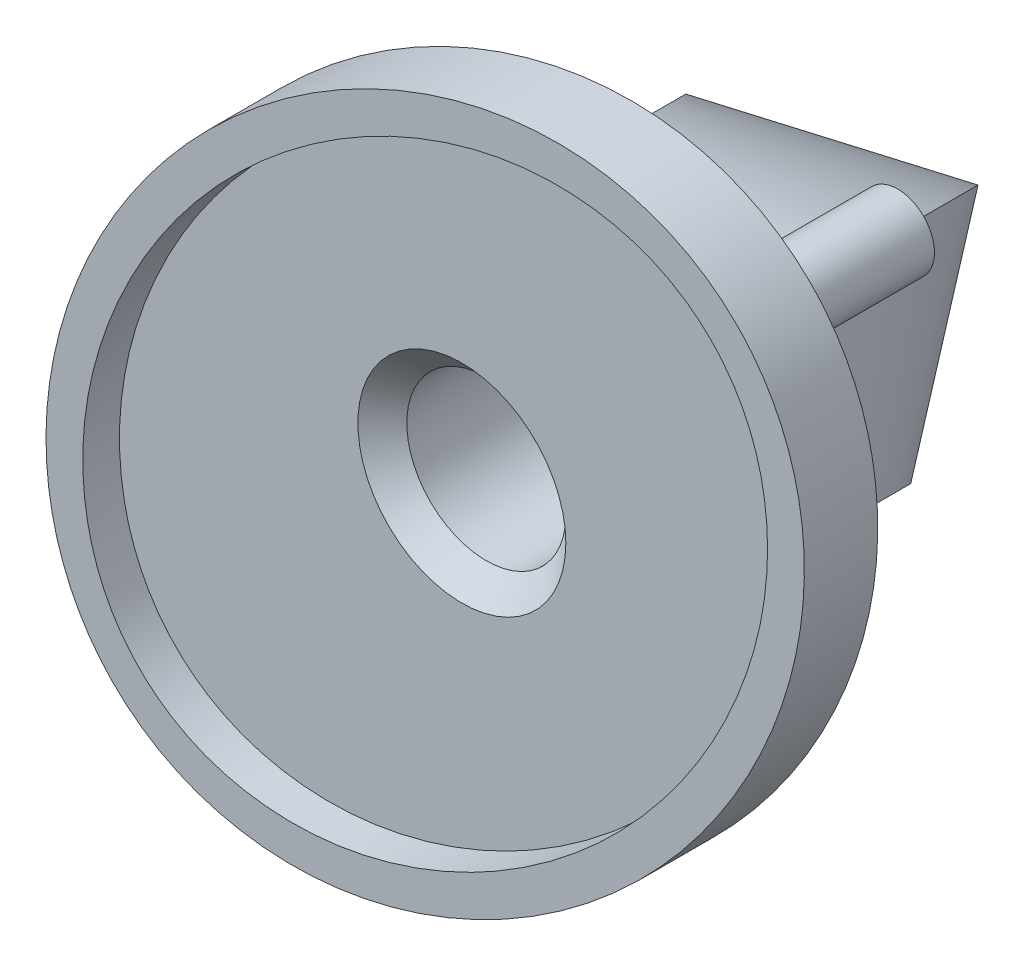
ISO-10303-21;
HEADER;
FILE_DESCRIPTION(('STEP AP214'),'2;1');
FILE_NAME('part.step','',(''),(''),'','','');
FILE_SCHEMA(('AUTOMOTIVE_DESIGN { 1 0 10303 214 1 1 1 1 }'));
ENDSEC;
DATA;
#1=APPLICATION_CONTEXT('core data for automotive mechanical design processes');
#2=APPLICATION_PROTOCOL_DEFINITION('international standard','automotive_design',2000,#1);
#3=PRODUCT_CONTEXT('',#1,'mechanical');
#4=PRODUCT('Part','Part','',(#3));
#5=PRODUCT_RELATED_PRODUCT_CATEGORY('part','',(#4));
#6=PRODUCT_DEFINITION_FORMATION('','',#4);
#7=PRODUCT_DEFINITION_CONTEXT('part definition',#1,'design');
#8=PRODUCT_DEFINITION('design','',#6,#7);
#9=PRODUCT_DEFINITION_SHAPE('','',#8);
#10=(LENGTH_UNIT() NAMED_UNIT(*) SI_UNIT(.MILLI.,.METRE.));
#11=(NAMED_UNIT(*) PLANE_ANGLE_UNIT() SI_UNIT($,.RADIAN.));
#12=(NAMED_UNIT(*) SI_UNIT($,.STERADIAN.) SOLID_ANGLE_UNIT());
#13=UNCERTAINTY_MEASURE_WITH_UNIT(LENGTH_MEASURE(1.E-05),#10,'distance_accuracy_value','');
#14=(GEOMETRIC_REPRESENTATION_CONTEXT(3) GLOBAL_UNCERTAINTY_ASSIGNED_CONTEXT((#13)) GLOBAL_UNIT_ASSIGNED_CONTEXT((#10,
#11,#12)) REPRESENTATION_CONTEXT('',''));
#15=CARTESIAN_POINT('',(0.,0.,0.));
#16=DIRECTION('',(0.,0.,1.));
#17=DIRECTION('',(1.,0.,0.));
#18=AXIS2_PLACEMENT_3D('',#15,#16,#17);
#19=CARTESIAN_POINT('',(0.,1.75,-1.5));
#20=DIRECTION('',(0.,-1.,0.));
#21=DIRECTION('',(0.,0.,-1.));
#22=AXIS2_PLACEMENT_3D('',#19,#20,#21);
#23=PLANE('',#22);
#24=DIRECTION('',(0.,0.,1.));
#25=VECTOR('',#24,1.);
#26=CARTESIAN_POINT('',(2.73861278752583,1.75,-1.5));
#27=LINE('',#26,#25);
#28=CARTESIAN_POINT('',(2.73861278752583,1.75,-13.5));
#29=VERTEX_POINT('',#28);
#30=CARTESIAN_POINT('',(2.73861278752583,1.75,-6.));
#31=VERTEX_POINT('',#30);
#32=EDGE_CURVE('E121',#29,#31,#27,.T.);
#33=ORIENTED_EDGE('',*,*,#32,.T.);
#34=DIRECTION('',(-1.,0.,0.));
#35=VECTOR('',#34,1.);
#36=CARTESIAN_POINT('',(0.,1.75,-6.));
#37=LINE('',#36,#35);
#38=CARTESIAN_POINT('',(-2.73861278752583,1.75,-6.));
#39=VERTEX_POINT('',#38);
#40=EDGE_CURVE('E346',#31,#39,#37,.T.);
#41=ORIENTED_EDGE('',*,*,#40,.T.);
#42=DIRECTION('',(0.,0.,1.));
#43=VECTOR('',#42,1.);
#44=CARTESIAN_POINT('',(-2.73861278752583,1.75,-1.5));
#45=LINE('',#44,#43);
#46=CARTESIAN_POINT('',(-2.73861278752583,1.75,-13.5));
#47=VERTEX_POINT('',#46);
#48=EDGE_CURVE('E132',#47,#39,#45,.T.);
#49=ORIENTED_EDGE('',*,*,#48,.F.);
#50=DIRECTION('',(-1.,0.,0.));
#51=VECTOR('',#50,1.);
#52=CARTESIAN_POINT('',(2.73861278752583,1.75,-13.5));
#53=LINE('',#52,#51);
#54=EDGE_CURVE('E137',#29,#47,#53,.T.);
#55=ORIENTED_EDGE('',*,*,#54,.F.);
#56=EDGE_LOOP('',(#33,#41,#49,#55));
#57=FACE_BOUND('',#56,.T.);
#58=ADVANCED_FACE('F57',(#57),#23,.T.);
#59=CARTESIAN_POINT('',(4.59619407771255,-4.59619407771257,-1.5));
#60=DIRECTION('',(-0.707106781186546,0.707106781186549,0.));
#61=DIRECTION('',(-0.707106781186549,-0.707106781186546,0.));
#62=AXIS2_PLACEMENT_3D('',#59,#60,#61);
#63=CONICAL_SURFACE('',#62,10.,0.745419476274158);
#64=CARTESIAN_POINT('',(11.3675294374418,9.81467437442868,-0.9998));
#65=CARTESIAN_POINT('',(11.3706137012121,9.81478939033697,-1.12559662171696));
#66=CARTESIAN_POINT('',(11.372534422561,9.81486303084294,-1.25141886066279));
#67=CARTESIAN_POINT('',(11.3740482815762,9.81492164569019,-1.50307724922639));
#68=CARTESIAN_POINT('',(11.3736414212789,9.81490662010902,-1.62891339883189));
#69=CARTESIAN_POINT('',(11.3689291445444,9.81471968806605,-2.00635343013596));
#70=CARTESIAN_POINT('',(11.3611328567553,9.8144059602027,-2.25792253493445));
#71=CARTESIAN_POINT('',(11.3363250445813,9.81382876508889,-2.75910442610907));
#72=CARTESIAN_POINT('',(11.3193684082185,9.81356501098766,-3.00871997063354));
#73=CARTESIAN_POINT('',(11.2763269365788,9.81401970211461,-3.50718748745144));
#74=CARTESIAN_POINT('',(11.2502412933191,9.81473823429858,-3.75603939018979));
#75=CARTESIAN_POINT('',(11.1885306056162,9.81861575626189,-4.25679610144112));
#76=CARTESIAN_POINT('',(11.1527522799192,9.82181564941633,-4.50868172837949));
#77=CARTESIAN_POINT('',(11.072063271918,9.83273874180308,-5.0108565979712));
#78=CARTESIAN_POINT('',(11.0271545232362,9.84046098395157,-5.2611461670785));
#79=CARTESIAN_POINT('',(10.9530495070987,9.85749197628367,-5.63579764000728));
#80=CARTESIAN_POINT('',(10.9271330717293,9.86410602712989,-5.76093850734703));
#81=CARTESIAN_POINT('',(10.8731443156247,9.87959113970417,-6.0106101098969));
#82=CARTESIAN_POINT('',(10.8450721212387,9.88846206922669,-6.13514088041046));
#83=CARTESIAN_POINT('',(10.7868303347956,9.90894595265881,-6.38359204595669));
#84=CARTESIAN_POINT('',(10.7566591356605,9.92056102425792,-6.50751189375605));
#85=CARTESIAN_POINT('',(10.6943518082272,9.94713338066743,-6.75452201589148));
#86=CARTESIAN_POINT('',(10.6622152643118,9.96209137420328,-6.87761210860396));
#87=CARTESIAN_POINT('',(10.629159061015,9.97902049537672,-7.00019999999952));
#88=B_SPLINE_CURVE_WITH_KNOTS('',3,(#64,#65,#66,#67,#68,#69,#70,#71,#72,#73,#74,#75,#76,#77,#78,
#79,#80,#81,#82,#83,#84,#85,#86,#87),.UNSPECIFIED.,.F.,.F.,(4,2,2,2,2,2,2,2,2,2,2,4),(0.,
0.37749214946309,0.754983968657662,1.50986671754535,2.26027564650348,3.0107510088541,
3.77386743086804,4.53682240966372,4.92069243698366,5.30453998278435,5.68868472183178,
6.07291097993981),.UNSPECIFIED.);
#89=CARTESIAN_POINT('',(11.3736605565081,9.81490706090207,-1.5));
#90=VERTEX_POINT('',#89);
#91=CARTESIAN_POINT('',(10.7581460663781,9.92038499617712,-6.5));
#92=VERTEX_POINT('',#91);
#93=EDGE_CURVE('E162',#90,#92,#88,.T.);
#94=ORIENTED_EDGE('',*,*,#93,.F.);
#95=DIRECTION('',(-0.0399680383488699,0.999200958721789,0.));
#96=VECTOR('',#95,1.);
#97=CARTESIAN_POINT('',(11.667261889578,2.4748737341529,-1.5));
#98=LINE('',#97,#96);
#99=CARTESIAN_POINT('',(11.667261889578,2.4748737341529,-1.5));
#100=VERTEX_POINT('',#99);
#101=EDGE_CURVE('E235',#100,#90,#98,.T.);
#102=ORIENTED_EDGE('',*,*,#101,.F.);
#103=CARTESIAN_POINT('',(4.59619407771255,-4.59619407771257,-1.5));
#104=DIRECTION('',(0.707106781186546,-0.707106781186549,0.));
#105=DIRECTION('',(0.707106781186549,0.707106781186546,0.));
#106=AXIS2_PLACEMENT_3D('',#103,#104,#105);
#107=CIRCLE('',#106,10.);
#108=CARTESIAN_POINT('',(-2.47487373415294,-11.667261889578,-1.5));
#109=VERTEX_POINT('',#108);
#110=EDGE_CURVE('E259',#109,#100,#107,.T.);
#111=ORIENTED_EDGE('',*,*,#110,.F.);
#112=DIRECTION('',(-0.99920095872179,0.0399680383488734,0.));
#113=VECTOR('',#112,1.);
#114=CARTESIAN_POINT('',(-2.47487373415294,-11.667261889578,-1.5));
#115=LINE('',#114,#113);
#116=CARTESIAN_POINT('',(-11.3137084989848,-11.3137084989847,-1.5));
#117=VERTEX_POINT('',#116);
#118=EDGE_CURVE('E245',#109,#117,#115,.T.);
#119=ORIENTED_EDGE('',*,*,#118,.T.);
#120=CARTESIAN_POINT('',(0.,0.,-1.5));
#121=DIRECTION('',(0.707106781186546,-0.707106781186549,0.));
#122=DIRECTION('',(0.707106781186549,0.707106781186546,0.));
#123=AXIS2_PLACEMENT_3D('',#120,#121,#122);
#124=CIRCLE('',#123,16.);
#125=CARTESIAN_POINT('',(10.7470926301024,10.7470926301023,-6.5));
#126=VERTEX_POINT('',#125);
#127=EDGE_CURVE('E244',#117,#126,#124,.T.);
#128=ORIENTED_EDGE('',*,*,#127,.T.);
#129=CARTESIAN_POINT('',(10.6961577836758,13.6986113804847,-6.5));
#130=CARTESIAN_POINT('',(10.7065162455169,13.1761851826885,-6.5));
#131=CARTESIAN_POINT('',(10.7162609370769,12.6537460031276,-6.5));
#132=CARTESIAN_POINT('',(10.7342068400994,11.6088483408996,-6.5));
#133=CARTESIAN_POINT('',(10.7424080723828,11.086389858588,-6.5));
#134=CARTESIAN_POINT('',(10.7569514494125,10.0414435999574,-6.5));
#135=CARTESIAN_POINT('',(10.7632935850655,9.51895582350756,-6.5));
#136=CARTESIAN_POINT('',(10.7736378671408,8.47395038262135,-6.5));
#137=CARTESIAN_POINT('',(10.7776399818403,7.95143271787579,-6.5));
#138=CARTESIAN_POINT('',(10.7802315663374,7.4289056174848,-6.5));
#139=B_SPLINE_CURVE_WITH_KNOTS('',3,(#129,#130,#131,#132,#133,#134,#135,#136,#137,#138),
.UNSPECIFIED.,.F.,.F.,(4,2,2,2,4),(0.,1.5675874133,3.13515367868541,4.70272761134626,
6.27032279461941),.UNSPECIFIED.);
#140=EDGE_CURVE('E151',#126,#92,#139,.T.);
#141=ORIENTED_EDGE('',*,*,#140,.T.);
#142=EDGE_LOOP('',(#94,#102,#111,#119,#128,#141));
#143=FACE_BOUND('',#142,.T.);
#144=ADVANCED_FACE('F169',(#143),#63,.T.);
#145=CARTESIAN_POINT('',(-4.59619407771255,4.59619407771257,-1.5));
#146=DIRECTION('',(0.707106781186546,-0.707106781186549,0.));
#147=DIRECTION('',(-0.707106781186549,-0.707106781186546,0.));
#148=AXIS2_PLACEMENT_3D('',#145,#146,#147);
#149=CONICAL_SURFACE('',#148,10.,0.745419476274158);
#150=CARTESIAN_POINT('',(9.97902049537675,10.6291590610149,-7.00019999999952));
#151=CARTESIAN_POINT('',(9.96232205665428,10.6617630664738,-6.87928849616362));
#152=CARTESIAN_POINT('',(9.94754221602835,10.6934727073468,-6.75788798960058));
#153=CARTESIAN_POINT('',(9.92124351948815,10.7549813765055,-6.51427706768364));
#154=CARTESIAN_POINT('',(9.90972399277052,10.7847807968382,-6.39206682423491));
#155=CARTESIAN_POINT('',(9.8893710983587,10.842338646037,-6.14704833974728));
#156=CARTESIAN_POINT('',(9.88053568319608,10.8700986182976,-6.02424062749061));
#157=CARTESIAN_POINT('',(9.86507848284734,10.9235243776306,-5.77802804988364));
#158=CARTESIAN_POINT('',(9.85845682370148,10.9491900454008,-5.65462315093816));
#159=CARTESIAN_POINT('',(9.84135961106463,11.0226443678568,-5.28515437298425));
#160=CARTESIAN_POINT('',(9.83353722469693,11.0672460607329,-5.03832658963909));
#161=CARTESIAN_POINT('',(9.82238735423488,11.1475781525686,-4.5431000671773));
#162=CARTESIAN_POINT('',(9.81906083153805,11.1833066527478,-4.29470100346321));
#163=CARTESIAN_POINT('',(9.8149027522869,11.2460275564295,-3.79407341898586));
#164=CARTESIAN_POINT('',(9.81409835883387,11.2729220743096,-3.54183241239227));
#165=CARTESIAN_POINT('',(9.81354884553611,11.3173306136446,-3.03654984102077));
#166=CARTESIAN_POINT('',(9.81380363797284,11.3348454117635,-2.78350834427129));
#167=CARTESIAN_POINT('',(9.81438292873482,11.360519041226,-2.27540711035424));
#168=CARTESIAN_POINT('',(9.81470783996323,11.3686205548435,-2.02034443276475));
#169=CARTESIAN_POINT('',(9.81490474391463,11.3735951641379,-1.63765901814342));
#170=CARTESIAN_POINT('',(9.81492195981767,11.3740568884726,-1.51007374191432));
#171=CARTESIAN_POINT('',(9.81486517332319,11.3725875960083,-1.2549168809886));
#172=CARTESIAN_POINT('',(9.8147911708502,11.3706565772294,-1.1273452963034));
#173=CARTESIAN_POINT('',(9.81467437442871,11.3675294374418,-0.999799999999999));
#174=B_SPLINE_CURVE_WITH_KNOTS('',3,(#150,#151,#152,#153,#154,#155,#156,#157,#158,#159,#160,
#161,#162,#163,#164,#165,#166,#167,#168,#169,#170,#171,#172,#173),.UNSPECIFIED.,.F.,.F.,(4,2,2,
2,2,2,2,2,2,2,2,4),(0.,0.378973528064604,0.757869026271653,1.13647476905694,1.51510206410305,
2.26769504269466,3.0204489306584,3.78128254357123,4.54205314783171,5.30743222191729,
5.69017117216309,6.07291043907808),.UNSPECIFIED.);
#175=CARTESIAN_POINT('',(9.92038499617715,10.7581460663781,-6.5));
#176=VERTEX_POINT('',#175);
#177=CARTESIAN_POINT('',(9.8149070609021,11.3736605565081,-1.5));
#178=VERTEX_POINT('',#177);
#179=EDGE_CURVE('E194',#176,#178,#174,.T.);
#180=ORIENTED_EDGE('',*,*,#179,.F.);
#181=CARTESIAN_POINT('',(7.42890561748481,10.7802315663374,-6.5));
#182=CARTESIAN_POINT('',(7.95143271787582,10.7776399818403,-6.5));
#183=CARTESIAN_POINT('',(8.47395038262138,10.7736378671408,-6.5));
#184=CARTESIAN_POINT('',(9.51895582350759,10.7632935850654,-6.5));
#185=CARTESIAN_POINT('',(10.0414435999574,10.7569514494125,-6.5));
#186=CARTESIAN_POINT('',(11.086389858588,10.7424080723828,-6.5));
#187=CARTESIAN_POINT('',(11.6088483408997,10.7342068400994,-6.5));
#188=CARTESIAN_POINT('',(12.6537460031276,10.7162609370769,-6.5));
#189=CARTESIAN_POINT('',(13.1761851826885,10.7065162455169,-6.5));
#190=CARTESIAN_POINT('',(13.6986113804848,10.6961577836758,-6.5));
#191=B_SPLINE_CURVE_WITH_KNOTS('',3,(#181,#182,#183,#184,#185,#186,#187,#188,#189,#190),
.UNSPECIFIED.,.F.,.F.,(4,2,2,2,4),(0.,1.56759518327316,3.13516911593401,4.70273538131943,
6.27032279461943),.UNSPECIFIED.);
#192=EDGE_CURVE('E184',#176,#126,#191,.T.);
#193=ORIENTED_EDGE('',*,*,#192,.T.);
#194=ORIENTED_EDGE('',*,*,#127,.F.);
#195=DIRECTION('',(0.0399680383488701,-0.99920095872179,0.));
#196=VECTOR('',#195,1.);
#197=CARTESIAN_POINT('',(-11.667261889578,-2.4748737341529,-1.5));
#198=LINE('',#197,#196);
#199=CARTESIAN_POINT('',(-11.667261889578,-2.4748737341529,-1.5));
#200=VERTEX_POINT('',#199);
#201=EDGE_CURVE('E286',#200,#117,#198,.T.);
#202=ORIENTED_EDGE('',*,*,#201,.F.);
#203=CARTESIAN_POINT('',(-4.59619407771255,4.59619407771257,-1.5));
#204=DIRECTION('',(0.707106781186546,-0.707106781186549,0.));
#205=DIRECTION('',(0.707106781186549,0.707106781186546,0.));
#206=AXIS2_PLACEMENT_3D('',#203,#204,#205);
#207=CIRCLE('',#206,10.);
#208=CARTESIAN_POINT('',(2.47487373415294,11.667261889578,-1.5));
#209=VERTEX_POINT('',#208);
#210=EDGE_CURVE('E196',#200,#209,#207,.T.);
#211=ORIENTED_EDGE('',*,*,#210,.T.);
#212=DIRECTION('',(0.999200958721789,-0.0399680383488734,0.));
#213=VECTOR('',#212,1.);
#214=CARTESIAN_POINT('',(2.47487373415294,11.667261889578,-1.5));
#215=LINE('',#214,#213);
#216=EDGE_CURVE('E275',#209,#178,#215,.T.);
#217=ORIENTED_EDGE('',*,*,#216,.T.);
#218=EDGE_LOOP('',(#180,#193,#194,#202,#211,#217));
#219=FACE_BOUND('',#218,.T.);
#220=ADVANCED_FACE('F204',(#219),#149,.T.);
#221=CARTESIAN_POINT('',(0.,0.,-1.5));
#222=DIRECTION('',(0.,0.,1.));
#223=DIRECTION('',(1.,0.,0.));
#224=AXIS2_PLACEMENT_3D('',#221,#222,#223);
#225=PLANE('',#224);
#226=CARTESIAN_POINT('',(11.3137084989848,11.3137084989848,-1.5));
#227=DIRECTION('',(0.,0.,-1.));
#228=DIRECTION('',(-1.,0.,0.));
#229=AXIS2_PLACEMENT_3D('',#226,#227,#228);
#230=CIRCLE('',#229,1.5);
#231=EDGE_CURVE('E142',#178,#90,#230,.T.);
#232=ORIENTED_EDGE('',*,*,#231,.F.);
#233=ORIENTED_EDGE('',*,*,#216,.F.);
#234=DIRECTION('',(-0.707106781186549,-0.707106781186546,0.));
#235=VECTOR('',#234,1.);
#236=CARTESIAN_POINT('',(2.47487373415294,11.667261889578,-1.5));
#237=LINE('',#236,#235);
#238=EDGE_CURVE('E284',#209,#200,#237,.T.);
#239=ORIENTED_EDGE('',*,*,#238,.T.);
#240=ORIENTED_EDGE('',*,*,#201,.T.);
#241=ORIENTED_EDGE('',*,*,#118,.F.);
#242=DIRECTION('',(-0.707106781186549,-0.707106781186546,0.));
#243=VECTOR('',#242,1.);
#244=CARTESIAN_POINT('',(11.667261889578,2.4748737341529,-1.5));
#245=LINE('',#244,#243);
#246=EDGE_CURVE('E251',#100,#109,#245,.T.);
#247=ORIENTED_EDGE('',*,*,#246,.F.);
#248=ORIENTED_EDGE('',*,*,#101,.T.);
#249=EDGE_LOOP('',(#232,#233,#239,#240,#241,#247,#248));
#250=FACE_BOUND('',#249,.T.);
#251=CARTESIAN_POINT('',(0.,0.,-1.5));
#252=DIRECTION('',(0.,0.,1.));
#253=DIRECTION('',(0.707106781186551,0.707106781186544,0.));
#254=AXIS2_PLACEMENT_3D('',#251,#252,#253);
#255=ELLIPSE('',#254,18.,12.5);
#256=CARTESIAN_POINT('',(12.7279220613579,12.7279220613578,-1.5));
#257=VERTEX_POINT('',#256);
#258=EDGE_CURVE('E133',#257,#257,#255,.T.);
#259=ORIENTED_EDGE('',*,*,#258,.F.);
#260=EDGE_LOOP('',(#259));
#261=FACE_BOUND('',#260,.T.);
#262=ADVANCED_FACE('F207',(#250,#261),#225,.F.);
#263=CARTESIAN_POINT('',(0.,0.,-1.5));
#264=DIRECTION('',(0.,0.,1.));
#265=DIRECTION('',(1.,0.,0.));
#266=AXIS2_PLACEMENT_3D('',#263,#264,#265);
#267=CYLINDRICAL_SURFACE('',#266,3.25);
#268=CARTESIAN_POINT('',(0.,0.,-0.999999999999987));
#269=DIRECTION('',(0.,0.,1.));
#270=DIRECTION('',(1.,0.,0.));
#271=AXIS2_PLACEMENT_3D('',#268,#269,#270);
#272=CIRCLE('',#271,3.25);
#273=CARTESIAN_POINT('',(3.25,0.,-0.999999999999987));
#274=VERTEX_POINT('',#273);
#275=EDGE_CURVE('E350',#274,#274,#272,.T.);
#276=ORIENTED_EDGE('',*,*,#275,.T.);
#277=EDGE_LOOP('',(#276));
#278=FACE_BOUND('',#277,.T.);
#279=CARTESIAN_POINT('',(0.,0.,-5.));
#280=DIRECTION('',(0.,0.,1.));
#281=DIRECTION('',(1.,0.,0.));
#282=AXIS2_PLACEMENT_3D('',#279,#280,#281);
#283=CIRCLE('',#282,3.25);
#284=CARTESIAN_POINT('',(1.73205080756888,2.75,-5.));
#285=VERTEX_POINT('',#284);
#286=CARTESIAN_POINT('',(-1.73205080756888,2.75,-5.));
#287=VERTEX_POINT('',#286);
#288=EDGE_CURVE('E139',#285,#287,#283,.T.);
#289=ORIENTED_EDGE('',*,*,#288,.F.);
#290=CARTESIAN_POINT('',(0.,0.,-7.75));
#291=DIRECTION('',(0.,0.707106781186547,-0.707106781186548));
#292=DIRECTION('',(0.,0.707106781186548,0.707106781186547));
#293=AXIS2_PLACEMENT_3D('',#290,#291,#292);
#294=ELLIPSE('',#293,4.59619407771256,3.25);
#295=EDGE_CURVE('E12',#285,#31,#294,.T.);
#296=ORIENTED_EDGE('',*,*,#295,.T.);
#297=ORIENTED_EDGE('',*,*,#32,.F.);
#298=CARTESIAN_POINT('',(0.,0.,-13.5));
#299=DIRECTION('',(0.,0.,1.));
#300=DIRECTION('',(1.,0.,0.));
#301=AXIS2_PLACEMENT_3D('',#298,#299,#300);
#302=CIRCLE('',#301,3.25);
#303=EDGE_CURVE('E124',#47,#29,#302,.T.);
#304=ORIENTED_EDGE('',*,*,#303,.F.);
#305=ORIENTED_EDGE('',*,*,#48,.T.);
#306=CARTESIAN_POINT('',(0.,0.,-7.75));
#307=DIRECTION('',(0.,0.707106781186547,-0.707106781186548));
#308=DIRECTION('',(0.,0.707106781186548,0.707106781186547));
#309=AXIS2_PLACEMENT_3D('',#306,#307,#308);
#310=ELLIPSE('',#309,4.59619407771256,3.25);
#311=EDGE_CURVE('E67',#39,#287,#310,.T.);
#312=ORIENTED_EDGE('',*,*,#311,.T.);
#313=EDGE_LOOP('',(#289,#296,#297,#304,#305,#312));
#314=FACE_BOUND('',#313,.T.);
#315=ADVANCED_FACE('F123',(#278,#314),#267,.F.);
#316=DIRECTION('',(0.,0.,1.));
#317=VECTOR('',#316,1.);
#318=SURFACE_OF_LINEAR_EXTRUSION('',#255,#317);
#319=ORIENTED_EDGE('',*,*,#258,.T.);
#320=EDGE_LOOP('',(#319));
#321=FACE_BOUND('',#320,.T.);
#322=CARTESIAN_POINT('',(0.,0.,1.5));
#323=DIRECTION('',(0.,0.,1.));
#324=DIRECTION('',(0.707106781186551,0.707106781186544,0.));
#325=AXIS2_PLACEMENT_3D('',#322,#323,#324);
#326=ELLIPSE('',#325,18.,12.5);
#327=CARTESIAN_POINT('',(12.7279220613579,12.7279220613578,1.5));
#328=VERTEX_POINT('',#327);
#329=EDGE_CURVE('E320',#328,#328,#326,.T.);
#330=ORIENTED_EDGE('',*,*,#329,.F.);
#331=EDGE_LOOP('',(#330));
#332=FACE_BOUND('',#331,.T.);
#333=ADVANCED_FACE('F323',(#321,#332),#318,.T.);
#334=CARTESIAN_POINT('',(0.,0.,0.));
#335=DIRECTION('',(0.,0.,1.));
#336=DIRECTION('',(1.,0.,0.));
#337=AXIS2_PLACEMENT_3D('',#334,#335,#336);
#338=PLANE('',#337);
#339=CARTESIAN_POINT('',(0.,0.,0.));
#340=DIRECTION('',(0.,0.,1.));
#341=DIRECTION('',(1.,0.,0.));
#342=AXIS2_PLACEMENT_3D('',#339,#340,#341);
#343=CIRCLE('',#342,4.24999999999999);
#344=CARTESIAN_POINT('',(4.24999999999999,0.,0.));
#345=VERTEX_POINT('',#344);
#346=EDGE_CURVE('E356',#345,#345,#343,.F.);
#347=ORIENTED_EDGE('',*,*,#346,.T.);
#348=EDGE_LOOP('',(#347));
#349=FACE_BOUND('',#348,.T.);
#350=CARTESIAN_POINT('',(11.6672618895781,11.667261889578,0.));
#351=CARTESIAN_POINT('',(10.7070505007903,12.6274732783658,0.));
#352=CARTESIAN_POINT('',(8.24935748535579,14.0106258180826,0.));
#353=CARTESIAN_POINT('',(3.12069216417964,14.1452791200165,0.));
#354=CARTESIAN_POINT('',(-2.63493639244995,12.0511145448453,0.));
#355=CARTESIAN_POINT('',(-7.99574915525417,7.99574915525425,0.));
#356=CARTESIAN_POINT('',(-12.0511145448453,2.63493639245008,0.));
#357=CARTESIAN_POINT('',(-14.1452791200166,-3.12069216417949,0.));
#358=CARTESIAN_POINT('',(-14.0106258180827,-8.24935748535563,0.));
#359=CARTESIAN_POINT('',(-11.9358970085075,-11.9358970085074,0.));
#360=CARTESIAN_POINT('',(-8.24935748535579,-14.0106258180826,0.));
#361=CARTESIAN_POINT('',(-3.12069216417965,-14.1452791200165,0.));
#362=CARTESIAN_POINT('',(2.63493639244994,-12.0511145448453,0.));
#363=CARTESIAN_POINT('',(7.99574915525417,-7.99574915525426,0.));
#364=CARTESIAN_POINT('',(12.0511145448453,-2.63493639245008,0.));
#365=CARTESIAN_POINT('',(14.1452791200166,3.12069216417948,0.));
#366=CARTESIAN_POINT('',(14.0106258180827,8.24935748535563,0.));
#367=CARTESIAN_POINT('',(12.6274732783659,10.7070505007901,0.));
#368=CARTESIAN_POINT('',(11.6672618895781,11.667261889578,0.));
#369=B_SPLINE_CURVE_WITH_KNOTS('',3,(#350,#351,#352,#353,#354,#355,#356,#357,#358,#359,#360,
#361,#362,#363,#364,#365,#366,#367,#368),.UNSPECIFIED.,.T.,.F.,(4,1,1,1,1,1,1,1,1,1,1,1,1,1,1,1,
4),(0.,0.392699081698724,0.785398163397448,1.17809724509617,1.5707963267949,1.96349540849362,
2.35619449019234,2.74889357189107,3.14159265358979,3.53429173528852,3.92699081698724,
4.31968989868597,4.71238898038469,5.10508806208341,5.49778714378214,5.89048622548086,
6.28318530717959),.UNSPECIFIED.);
#370=CARTESIAN_POINT('',(11.6672618895781,11.667261889578,0.));
#371=VERTEX_POINT('',#370);
#372=EDGE_CURVE('E195',#371,#371,#369,.F.);
#373=ORIENTED_EDGE('',*,*,#372,.F.);
#374=EDGE_LOOP('',(#373));
#375=FACE_BOUND('',#374,.T.);
#376=ADVANCED_FACE('F327',(#349,#375),#338,.T.);
#377=CARTESIAN_POINT('',(0.,0.,1.5));
#378=DIRECTION('',(0.,0.,1.));
#379=DIRECTION('',(1.,0.,0.));
#380=AXIS2_PLACEMENT_3D('',#377,#378,#379);
#381=PLANE('',#380);
#382=ORIENTED_EDGE('',*,*,#329,.T.);
#383=EDGE_LOOP('',(#382));
#384=FACE_BOUND('',#383,.T.);
#385=CARTESIAN_POINT('',(11.6672618895781,11.667261889578,1.5));
#386=CARTESIAN_POINT('',(10.7070505007903,12.6274732783658,1.5));
#387=CARTESIAN_POINT('',(8.24935748535579,14.0106258180826,1.5));
#388=CARTESIAN_POINT('',(3.12069216417964,14.1452791200165,1.5));
#389=CARTESIAN_POINT('',(-2.63493639244995,12.0511145448453,1.5));
#390=CARTESIAN_POINT('',(-7.99574915525417,7.99574915525425,1.5));
#391=CARTESIAN_POINT('',(-12.0511145448453,2.63493639245008,1.5));
#392=CARTESIAN_POINT('',(-14.1452791200166,-3.12069216417949,1.5));
#393=CARTESIAN_POINT('',(-14.0106258180827,-8.24935748535563,1.5));
#394=CARTESIAN_POINT('',(-11.9358970085075,-11.9358970085074,1.5));
#395=CARTESIAN_POINT('',(-8.24935748535579,-14.0106258180826,1.5));
#396=CARTESIAN_POINT('',(-3.12069216417965,-14.1452791200165,1.5));
#397=CARTESIAN_POINT('',(2.63493639244994,-12.0511145448453,1.5));
#398=CARTESIAN_POINT('',(7.99574915525417,-7.99574915525426,1.5));
#399=CARTESIAN_POINT('',(12.0511145448453,-2.63493639245008,1.5));
#400=CARTESIAN_POINT('',(14.1452791200166,3.12069216417948,1.5));
#401=CARTESIAN_POINT('',(14.0106258180827,8.24935748535563,1.5));
#402=CARTESIAN_POINT('',(12.6274732783659,10.7070505007901,1.5));
#403=CARTESIAN_POINT('',(11.6672618895781,11.667261889578,1.5));
#404=B_SPLINE_CURVE_WITH_KNOTS('',3,(#385,#386,#387,#388,#389,#390,#391,#392,#393,#394,#395,
#396,#397,#398,#399,#400,#401,#402,#403),.UNSPECIFIED.,.T.,.F.,(4,1,1,1,1,1,1,1,1,1,1,1,1,1,1,1,
4),(0.,0.392699081698724,0.785398163397448,1.17809724509617,1.5707963267949,1.96349540849362,
2.35619449019234,2.74889357189107,3.14159265358979,3.53429173528852,3.92699081698724,
4.31968989868597,4.71238898038469,5.10508806208341,5.49778714378214,5.89048622548086,
6.28318530717959),.UNSPECIFIED.);
#405=CARTESIAN_POINT('',(11.6672618895781,11.667261889578,1.5));
#406=VERTEX_POINT('',#405);
#407=EDGE_CURVE('E281',#406,#406,#404,.T.);
#408=ORIENTED_EDGE('',*,*,#407,.F.);
#409=EDGE_LOOP('',(#408));
#410=FACE_BOUND('',#409,.T.);
#411=ADVANCED_FACE('F366',(#384,#410),#381,.T.);
#412=DIRECTION('',(0.,0.,-1.));
#413=VECTOR('',#412,1.);
#414=SURFACE_OF_LINEAR_EXTRUSION('',#404,#413);
#415=ORIENTED_EDGE('',*,*,#407,.T.);
#416=EDGE_LOOP('',(#415));
#417=FACE_BOUND('',#416,.T.);
#418=ORIENTED_EDGE('',*,*,#372,.T.);
#419=EDGE_LOOP('',(#418));
#420=FACE_BOUND('',#419,.T.);
#421=ADVANCED_FACE('F369',(#417,#420),#414,.T.);
#422=CARTESIAN_POINT('',(4.59619407771255,-4.59619407771257,-1.5));
#423=DIRECTION('',(0.707106781186546,-0.707106781186549,0.));
#424=DIRECTION('',(0.707106781186549,0.707106781186546,0.));
#425=AXIS2_PLACEMENT_3D('',#422,#423,#424);
#426=PLANE('',#425);
#427=ORIENTED_EDGE('',*,*,#110,.T.);
#428=ORIENTED_EDGE('',*,*,#246,.T.);
#429=EDGE_LOOP('',(#427,#428));
#430=FACE_BOUND('',#429,.T.);
#431=ADVANCED_FACE('F211',(#430),#426,.T.);
#432=CARTESIAN_POINT('',(-4.59619407771255,4.59619407771257,-1.5));
#433=DIRECTION('',(-0.707106781186546,0.707106781186549,0.));
#434=DIRECTION('',(0.707106781186549,0.707106781186546,0.));
#435=AXIS2_PLACEMENT_3D('',#432,#433,#434);
#436=PLANE('',#435);
#437=ORIENTED_EDGE('',*,*,#210,.F.);
#438=ORIENTED_EDGE('',*,*,#238,.F.);
#439=EDGE_LOOP('',(#437,#438));
#440=FACE_BOUND('',#439,.T.);
#441=ADVANCED_FACE('F209',(#440),#436,.T.);
#442=CARTESIAN_POINT('',(11.3137084989848,11.3137084989848,-6.5));
#443=DIRECTION('',(0.,0.,1.));
#444=DIRECTION('',(1.,0.,0.));
#445=AXIS2_PLACEMENT_3D('',#442,#443,#444);
#446=CYLINDRICAL_SURFACE('',#445,1.5);
#447=ORIENTED_EDGE('',*,*,#231,.T.);
#448=ORIENTED_EDGE('',*,*,#93,.T.);
#449=CARTESIAN_POINT('',(11.3137084989848,11.3137084989848,-6.5));
#450=DIRECTION('',(0.,0.,-1.));
#451=DIRECTION('',(-1.,0.,0.));
#452=AXIS2_PLACEMENT_3D('',#449,#450,#451);
#453=CIRCLE('',#452,1.5);
#454=EDGE_CURVE('E145',#176,#92,#453,.T.);
#455=ORIENTED_EDGE('',*,*,#454,.F.);
#456=ORIENTED_EDGE('',*,*,#179,.T.);
#457=EDGE_LOOP('',(#447,#448,#455,#456));
#458=FACE_BOUND('',#457,.T.);
#459=ADVANCED_FACE('F177',(#458),#446,.T.);
#460=CARTESIAN_POINT('',(11.3137084989848,11.3137084989848,-6.5));
#461=DIRECTION('',(0.,0.,-1.));
#462=DIRECTION('',(-1.,0.,0.));
#463=AXIS2_PLACEMENT_3D('',#460,#461,#462);
#464=PLANE('',#463);
#465=ORIENTED_EDGE('',*,*,#140,.F.);
#466=ORIENTED_EDGE('',*,*,#192,.F.);
#467=ORIENTED_EDGE('',*,*,#454,.T.);
#468=EDGE_LOOP('',(#465,#466,#467));
#469=FACE_BOUND('',#468,.T.);
#470=ADVANCED_FACE('F173',(#469),#464,.T.);
#471=CARTESIAN_POINT('',(0.,0.,-13.5));
#472=DIRECTION('',(0.,0.,1.));
#473=DIRECTION('',(1.,0.,0.));
#474=AXIS2_PLACEMENT_3D('',#471,#472,#473);
#475=PLANE('',#474);
#476=ORIENTED_EDGE('',*,*,#303,.T.);
#477=ORIENTED_EDGE('',*,*,#54,.T.);
#478=EDGE_LOOP('',(#476,#477));
#479=FACE_BOUND('',#478,.T.);
#480=ADVANCED_FACE('F136',(#479),#475,.T.);
#481=CARTESIAN_POINT('',(0.,0.,-5.));
#482=DIRECTION('',(0.,0.,1.));
#483=DIRECTION('',(1.,0.,0.));
#484=AXIS2_PLACEMENT_3D('',#481,#482,#483);
#485=PLANE('',#484);
#486=ORIENTED_EDGE('',*,*,#288,.T.);
#487=DIRECTION('',(1.,0.,0.));
#488=VECTOR('',#487,1.);
#489=CARTESIAN_POINT('',(0.,2.75,-5.));
#490=LINE('',#489,#488);
#491=EDGE_CURVE('E79',#287,#285,#490,.T.);
#492=ORIENTED_EDGE('',*,*,#491,.T.);
#493=EDGE_LOOP('',(#486,#492));
#494=FACE_BOUND('',#493,.T.);
#495=ADVANCED_FACE('F339',(#494),#485,.T.);
#496=CARTESIAN_POINT('',(0.,1.75,-6.));
#497=DIRECTION('',(0.,0.707106781186547,-0.707106781186548));
#498=DIRECTION('',(-1.,0.,0.));
#499=AXIS2_PLACEMENT_3D('',#496,#497,#498);
#500=PLANE('',#499);
#501=ORIENTED_EDGE('',*,*,#295,.F.);
#502=ORIENTED_EDGE('',*,*,#491,.F.);
#503=ORIENTED_EDGE('',*,*,#311,.F.);
#504=ORIENTED_EDGE('',*,*,#40,.F.);
#505=EDGE_LOOP('',(#501,#502,#503,#504));
#506=FACE_BOUND('',#505,.T.);
#507=ADVANCED_FACE('F335',(#506),#500,.F.);
#508=CARTESIAN_POINT('',(0.,0.,-0.999999999999987));
#509=DIRECTION('',(0.,0.,1.));
#510=DIRECTION('',(1.,0.,0.));
#511=AXIS2_PLACEMENT_3D('',#508,#509,#510);
#512=CONICAL_SURFACE('',#511,3.25,0.78539816339745);
#513=ORIENTED_EDGE('',*,*,#346,.F.);
#514=EDGE_LOOP('',(#513));
#515=FACE_BOUND('',#514,.T.);
#516=ORIENTED_EDGE('',*,*,#275,.F.);
#517=EDGE_LOOP('',(#516));
#518=FACE_BOUND('',#517,.T.);
#519=ADVANCED_FACE('F60',(#515,#518),#512,.F.);
#520=CLOSED_SHELL('',(#58,#144,#220,#262,#315,#333,#376,#411,#421,#431,#441,#459,#470,#480,#495,
#507,#519));
#521=MANIFOLD_SOLID_BREP('B2',#520);
#522=ADVANCED_BREP_SHAPE_REPRESENTATION('',(#18,#521),#14);
#523=SHAPE_DEFINITION_REPRESENTATION(#9,#522);
ENDSEC;
END-ISO-10303-21;
